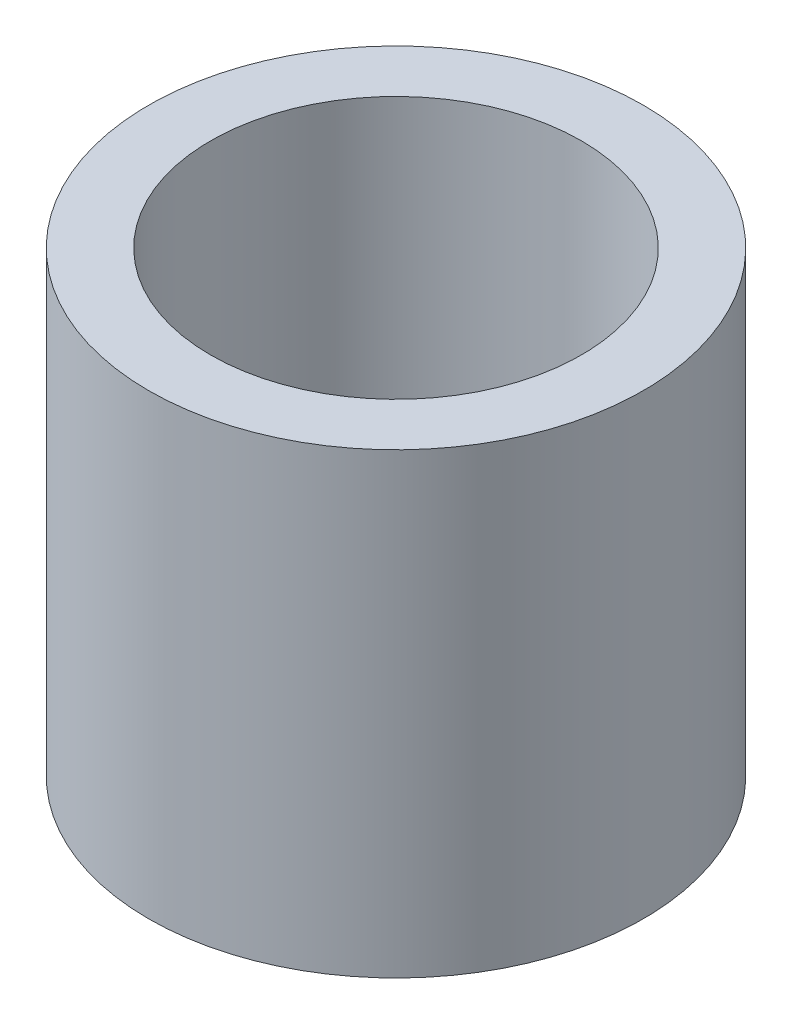
ISO-10303-21;
HEADER;
FILE_DESCRIPTION(('STEP AP214'),'2;1');
FILE_NAME('part.step','',(''),(''),'','','');
FILE_SCHEMA(('AUTOMOTIVE_DESIGN { 1 0 10303 214 1 1 1 1 }'));
ENDSEC;
DATA;
#1=APPLICATION_CONTEXT('core data for automotive mechanical design processes');
#2=APPLICATION_PROTOCOL_DEFINITION('international standard','automotive_design',2000,#1);
#3=PRODUCT_CONTEXT('',#1,'mechanical');
#4=PRODUCT('Part','Part','',(#3));
#5=PRODUCT_RELATED_PRODUCT_CATEGORY('part','',(#4));
#6=PRODUCT_DEFINITION_FORMATION('','',#4);
#7=PRODUCT_DEFINITION_CONTEXT('part definition',#1,'design');
#8=PRODUCT_DEFINITION('design','',#6,#7);
#9=PRODUCT_DEFINITION_SHAPE('','',#8);
#10=(LENGTH_UNIT() NAMED_UNIT(*) SI_UNIT(.MILLI.,.METRE.));
#11=(NAMED_UNIT(*) PLANE_ANGLE_UNIT() SI_UNIT($,.RADIAN.));
#12=(NAMED_UNIT(*) SI_UNIT($,.STERADIAN.) SOLID_ANGLE_UNIT());
#13=UNCERTAINTY_MEASURE_WITH_UNIT(LENGTH_MEASURE(1.E-05),#10,'distance_accuracy_value','');
#14=(GEOMETRIC_REPRESENTATION_CONTEXT(3) GLOBAL_UNCERTAINTY_ASSIGNED_CONTEXT((#13)) GLOBAL_UNIT_ASSIGNED_CONTEXT((#10,
#11,#12)) REPRESENTATION_CONTEXT('',''));
#15=CARTESIAN_POINT('',(0.,0.,0.));
#16=DIRECTION('',(0.,0.,1.));
#17=DIRECTION('',(1.,0.,0.));
#18=AXIS2_PLACEMENT_3D('',#15,#16,#17);
#19=CARTESIAN_POINT('',(0.,7.399,0.));
#20=DIRECTION('',(0.,-1.,0.));
#21=DIRECTION('',(0.,0.,-1.));
#22=AXIS2_PLACEMENT_3D('',#19,#20,#21);
#23=CYLINDRICAL_SURFACE('',#22,3.);
#24=CARTESIAN_POINT('',(0.,7.399,0.));
#25=DIRECTION('',(0.,1.,0.));
#26=DIRECTION('',(0.,0.,1.));
#27=AXIS2_PLACEMENT_3D('',#24,#25,#26);
#28=CIRCLE('',#27,3.);
#29=CARTESIAN_POINT('',(0.,7.399,-3.));
#30=VERTEX_POINT('',#29);
#31=EDGE_CURVE('E40',#30,#30,#28,.T.);
#32=CARTESIAN_POINT('',(0.,0.,0.));
#33=DIRECTION('',(0.,1.,0.));
#34=DIRECTION('',(0.,0.,1.));
#35=AXIS2_PLACEMENT_3D('',#32,#33,#34);
#36=CIRCLE('',#35,3.);
#37=CARTESIAN_POINT('',(0.,0.,-3.));
#38=VERTEX_POINT('',#37);
#39=EDGE_CURVE('E46',#38,#38,#36,.T.);
#40=CARTESIAN_POINT('',(0.,7.399,-3.));
#41=CARTESIAN_POINT('',(0.,7.32192708333333,-3.));
#42=CARTESIAN_POINT('',(0.,7.24485416666667,-3.));
#43=CARTESIAN_POINT('',(0.,7.09070833333333,-3.));
#44=CARTESIAN_POINT('',(0.,7.01363541666667,-3.));
#45=CARTESIAN_POINT('',(0.,6.85948958333333,-3.));
#46=CARTESIAN_POINT('',(0.,6.78241666666667,-3.));
#47=CARTESIAN_POINT('',(0.,6.62827083333333,-3.));
#48=CARTESIAN_POINT('',(0.,6.55119791666667,-3.));
#49=CARTESIAN_POINT('',(0.,6.39705208333333,-3.));
#50=CARTESIAN_POINT('',(0.,6.31997916666667,-3.));
#51=CARTESIAN_POINT('',(0.,6.16583333333333,-3.));
#52=CARTESIAN_POINT('',(0.,6.08876041666667,-3.));
#53=CARTESIAN_POINT('',(0.,5.93461458333333,-3.));
#54=CARTESIAN_POINT('',(0.,5.85754166666667,-3.));
#55=CARTESIAN_POINT('',(0.,5.70339583333333,-3.));
#56=CARTESIAN_POINT('',(0.,5.62632291666667,-3.));
#57=CARTESIAN_POINT('',(0.,5.47217708333333,-3.));
#58=CARTESIAN_POINT('',(0.,5.39510416666667,-3.));
#59=CARTESIAN_POINT('',(0.,5.24095833333333,-3.));
#60=CARTESIAN_POINT('',(0.,5.16388541666667,-3.));
#61=CARTESIAN_POINT('',(0.,5.00973958333333,-3.));
#62=CARTESIAN_POINT('',(0.,4.93266666666667,-3.));
#63=CARTESIAN_POINT('',(0.,4.77852083333333,-3.));
#64=CARTESIAN_POINT('',(0.,4.70144791666667,-3.));
#65=CARTESIAN_POINT('',(0.,4.54730208333333,-3.));
#66=CARTESIAN_POINT('',(0.,4.47022916666667,-3.));
#67=CARTESIAN_POINT('',(0.,4.31608333333333,-3.));
#68=CARTESIAN_POINT('',(0.,4.23901041666667,-3.));
#69=CARTESIAN_POINT('',(0.,4.08486458333333,-3.));
#70=CARTESIAN_POINT('',(0.,4.00779166666667,-3.));
#71=CARTESIAN_POINT('',(0.,3.85364583333333,-3.));
#72=CARTESIAN_POINT('',(0.,3.77657291666667,-3.));
#73=CARTESIAN_POINT('',(0.,3.62242708333333,-3.));
#74=CARTESIAN_POINT('',(0.,3.54535416666667,-3.));
#75=CARTESIAN_POINT('',(0.,3.39120833333333,-3.));
#76=CARTESIAN_POINT('',(0.,3.31413541666667,-3.));
#77=CARTESIAN_POINT('',(0.,3.15998958333333,-3.));
#78=CARTESIAN_POINT('',(0.,3.08291666666667,-3.));
#79=CARTESIAN_POINT('',(0.,2.92877083333333,-3.));
#80=CARTESIAN_POINT('',(0.,2.85169791666667,-3.));
#81=CARTESIAN_POINT('',(0.,2.69755208333333,-3.));
#82=CARTESIAN_POINT('',(0.,2.62047916666667,-3.));
#83=CARTESIAN_POINT('',(0.,2.46633333333333,-3.));
#84=CARTESIAN_POINT('',(0.,2.38926041666667,-3.));
#85=CARTESIAN_POINT('',(0.,2.23511458333333,-3.));
#86=CARTESIAN_POINT('',(0.,2.15804166666667,-3.));
#87=CARTESIAN_POINT('',(0.,2.00389583333333,-3.));
#88=CARTESIAN_POINT('',(0.,1.92682291666667,-3.));
#89=CARTESIAN_POINT('',(0.,1.77267708333333,-3.));
#90=CARTESIAN_POINT('',(0.,1.69560416666667,-3.));
#91=CARTESIAN_POINT('',(0.,1.54145833333333,-3.));
#92=CARTESIAN_POINT('',(0.,1.46438541666667,-3.));
#93=CARTESIAN_POINT('',(0.,1.31023958333333,-3.));
#94=CARTESIAN_POINT('',(0.,1.23316666666667,-3.));
#95=CARTESIAN_POINT('',(0.,1.07902083333333,-3.));
#96=CARTESIAN_POINT('',(0.,1.00194791666667,-3.));
#97=CARTESIAN_POINT('',(0.,0.847802083333334,-3.));
#98=CARTESIAN_POINT('',(0.,0.770729166666667,-3.));
#99=CARTESIAN_POINT('',(0.,0.616583333333333,-3.));
#100=CARTESIAN_POINT('',(0.,0.539510416666667,-3.));
#101=CARTESIAN_POINT('',(0.,0.385364583333333,-3.));
#102=CARTESIAN_POINT('',(0.,0.308291666666666,-3.));
#103=CARTESIAN_POINT('',(0.,0.154145833333333,-3.));
#104=CARTESIAN_POINT('',(0.,0.0770729166666666,-3.));
#105=CARTESIAN_POINT('',(0.,0.,-3.));
#106=B_SPLINE_CURVE_WITH_KNOTS('',3,(#40,#41,#42,#43,#44,#45,#46,#47,#48,#49,#50,#51,#52,#53,
#54,#55,#56,#57,#58,#59,#60,#61,#62,#63,#64,#65,#66,#67,#68,#69,#70,#71,#72,#73,#74,#75,#76,#77,
#78,#79,#80,#81,#82,#83,#84,#85,#86,#87,#88,#89,#90,#91,#92,#93,#94,#95,#96,#97,#98,#99,#100,
#101,#102,#103,#104,#105),.UNSPECIFIED.,.F.,.F.,(4,2,2,2,2,2,2,2,2,2,2,2,2,2,2,2,2,2,2,2,2,2,2,
2,2,2,2,2,2,2,2,2,4),(0.,0.231218750000001,0.4624375,0.693656250000001,0.924875,1.15609375,
1.3873125,1.61853125,1.84975,2.08096875,2.3121875,2.54340625,2.774625,3.00584375,3.2370625,
3.46828125,3.6995,3.93071875,4.1619375,4.39315625,4.624375,4.85559375,5.0868125,5.31803125,
5.54925,5.78046875,6.0116875,6.24290625,6.474125,6.70534375,6.9365625,7.16778125,7.399),.UNSPECIFIED.);
#107=EDGE_CURVE('BSEAM33',#30,#38,#106,.T.);
#108=ORIENTED_EDGE('',*,*,#31,.T.);
#109=ORIENTED_EDGE('',*,*,#39,.F.);
#110=ORIENTED_EDGE('',*,*,#107,.T.);
#111=ORIENTED_EDGE('',*,*,#107,.F.);
#112=EDGE_LOOP('',(#108,#110,#109,#111));
#113=FACE_BOUND('',#112,.T.);
#114=ADVANCED_FACE('F33',(#113),#23,.F.);
#115=CARTESIAN_POINT('',(0.,7.399,0.));
#116=DIRECTION('',(0.,-1.,0.));
#117=DIRECTION('',(0.,0.,-1.));
#118=AXIS2_PLACEMENT_3D('',#115,#116,#117);
#119=CYLINDRICAL_SURFACE('',#118,4.);
#120=CARTESIAN_POINT('',(0.,7.399,0.));
#121=DIRECTION('',(0.,1.,0.));
#122=DIRECTION('',(0.,0.,1.));
#123=AXIS2_PLACEMENT_3D('',#120,#121,#122);
#124=CIRCLE('',#123,4.);
#125=CARTESIAN_POINT('',(0.,7.399,-4.));
#126=VERTEX_POINT('',#125);
#127=EDGE_CURVE('E10',#126,#126,#124,.T.);
#128=CARTESIAN_POINT('',(0.,0.,0.));
#129=DIRECTION('',(0.,1.,0.));
#130=DIRECTION('',(0.,0.,1.));
#131=AXIS2_PLACEMENT_3D('',#128,#129,#130);
#132=CIRCLE('',#131,4.);
#133=CARTESIAN_POINT('',(0.,0.,-4.));
#134=VERTEX_POINT('',#133);
#135=EDGE_CURVE('E36',#134,#134,#132,.T.);
#136=CARTESIAN_POINT('',(0.,7.399,-4.));
#137=CARTESIAN_POINT('',(0.,7.32192708333333,-4.));
#138=CARTESIAN_POINT('',(0.,7.24485416666667,-4.));
#139=CARTESIAN_POINT('',(0.,7.09070833333333,-4.));
#140=CARTESIAN_POINT('',(0.,7.01363541666667,-4.));
#141=CARTESIAN_POINT('',(0.,6.85948958333333,-4.));
#142=CARTESIAN_POINT('',(0.,6.78241666666667,-4.));
#143=CARTESIAN_POINT('',(0.,6.62827083333333,-4.));
#144=CARTESIAN_POINT('',(0.,6.55119791666667,-4.));
#145=CARTESIAN_POINT('',(0.,6.39705208333333,-4.));
#146=CARTESIAN_POINT('',(0.,6.31997916666667,-4.));
#147=CARTESIAN_POINT('',(0.,6.16583333333333,-4.));
#148=CARTESIAN_POINT('',(0.,6.08876041666667,-4.));
#149=CARTESIAN_POINT('',(0.,5.93461458333333,-4.));
#150=CARTESIAN_POINT('',(0.,5.85754166666667,-4.));
#151=CARTESIAN_POINT('',(0.,5.70339583333333,-4.));
#152=CARTESIAN_POINT('',(0.,5.62632291666667,-4.));
#153=CARTESIAN_POINT('',(0.,5.47217708333333,-4.));
#154=CARTESIAN_POINT('',(0.,5.39510416666667,-4.));
#155=CARTESIAN_POINT('',(0.,5.24095833333333,-4.));
#156=CARTESIAN_POINT('',(0.,5.16388541666667,-4.));
#157=CARTESIAN_POINT('',(0.,5.00973958333333,-4.));
#158=CARTESIAN_POINT('',(0.,4.93266666666667,-4.));
#159=CARTESIAN_POINT('',(0.,4.77852083333333,-4.));
#160=CARTESIAN_POINT('',(0.,4.70144791666667,-4.));
#161=CARTESIAN_POINT('',(0.,4.54730208333333,-4.));
#162=CARTESIAN_POINT('',(0.,4.47022916666667,-4.));
#163=CARTESIAN_POINT('',(0.,4.31608333333333,-4.));
#164=CARTESIAN_POINT('',(0.,4.23901041666667,-4.));
#165=CARTESIAN_POINT('',(0.,4.08486458333333,-4.));
#166=CARTESIAN_POINT('',(0.,4.00779166666667,-4.));
#167=CARTESIAN_POINT('',(0.,3.85364583333333,-4.));
#168=CARTESIAN_POINT('',(0.,3.77657291666667,-4.));
#169=CARTESIAN_POINT('',(0.,3.62242708333333,-4.));
#170=CARTESIAN_POINT('',(0.,3.54535416666667,-4.));
#171=CARTESIAN_POINT('',(0.,3.39120833333333,-4.));
#172=CARTESIAN_POINT('',(0.,3.31413541666667,-4.));
#173=CARTESIAN_POINT('',(0.,3.15998958333333,-4.));
#174=CARTESIAN_POINT('',(0.,3.08291666666667,-4.));
#175=CARTESIAN_POINT('',(0.,2.92877083333333,-4.));
#176=CARTESIAN_POINT('',(0.,2.85169791666667,-4.));
#177=CARTESIAN_POINT('',(0.,2.69755208333333,-4.));
#178=CARTESIAN_POINT('',(0.,2.62047916666667,-4.));
#179=CARTESIAN_POINT('',(0.,2.46633333333333,-4.));
#180=CARTESIAN_POINT('',(0.,2.38926041666667,-4.));
#181=CARTESIAN_POINT('',(0.,2.23511458333333,-4.));
#182=CARTESIAN_POINT('',(0.,2.15804166666667,-4.));
#183=CARTESIAN_POINT('',(0.,2.00389583333333,-4.));
#184=CARTESIAN_POINT('',(0.,1.92682291666667,-4.));
#185=CARTESIAN_POINT('',(0.,1.77267708333333,-4.));
#186=CARTESIAN_POINT('',(0.,1.69560416666667,-4.));
#187=CARTESIAN_POINT('',(0.,1.54145833333333,-4.));
#188=CARTESIAN_POINT('',(0.,1.46438541666667,-4.));
#189=CARTESIAN_POINT('',(0.,1.31023958333333,-4.));
#190=CARTESIAN_POINT('',(0.,1.23316666666667,-4.));
#191=CARTESIAN_POINT('',(0.,1.07902083333333,-4.));
#192=CARTESIAN_POINT('',(0.,1.00194791666667,-4.));
#193=CARTESIAN_POINT('',(0.,0.847802083333333,-4.));
#194=CARTESIAN_POINT('',(0.,0.770729166666667,-4.));
#195=CARTESIAN_POINT('',(0.,0.616583333333333,-4.));
#196=CARTESIAN_POINT('',(0.,0.539510416666667,-4.));
#197=CARTESIAN_POINT('',(0.,0.385364583333333,-4.));
#198=CARTESIAN_POINT('',(0.,0.308291666666666,-4.));
#199=CARTESIAN_POINT('',(0.,0.154145833333333,-4.));
#200=CARTESIAN_POINT('',(0.,0.0770729166666666,-4.));
#201=CARTESIAN_POINT('',(0.,0.,-4.));
#202=B_SPLINE_CURVE_WITH_KNOTS('',3,(#136,#137,#138,#139,#140,#141,#142,#143,#144,#145,#146,
#147,#148,#149,#150,#151,#152,#153,#154,#155,#156,#157,#158,#159,#160,#161,#162,#163,#164,#165,
#166,#167,#168,#169,#170,#171,#172,#173,#174,#175,#176,#177,#178,#179,#180,#181,#182,#183,#184,
#185,#186,#187,#188,#189,#190,#191,#192,#193,#194,#195,#196,#197,#198,#199,#200,#201),
.UNSPECIFIED.,.F.,.F.,(4,2,2,2,2,2,2,2,2,2,2,2,2,2,2,2,2,2,2,2,2,2,2,2,2,2,2,2,2,2,2,2,4),(0.,
0.23121875,0.462437499999999,0.69365625,0.924874999999999,1.15609375,1.3873125,1.61853125,
1.84975,2.08096875,2.3121875,2.54340625,2.774625,3.00584375,3.2370625,3.46828125,3.6995,
3.93071875,4.1619375,4.39315625,4.624375,4.85559375,5.0868125,5.31803125,5.54925,5.78046875,
6.0116875,6.24290625,6.474125,6.70534375,6.9365625,7.16778125,7.399),.UNSPECIFIED.);
#203=EDGE_CURVE('BSEAM53',#126,#134,#202,.T.);
#204=ORIENTED_EDGE('',*,*,#127,.F.);
#205=ORIENTED_EDGE('',*,*,#135,.T.);
#206=ORIENTED_EDGE('',*,*,#203,.T.);
#207=ORIENTED_EDGE('',*,*,#203,.F.);
#208=EDGE_LOOP('',(#204,#206,#205,#207));
#209=FACE_BOUND('',#208,.T.);
#210=ADVANCED_FACE('F53',(#209),#119,.T.);
#211=CARTESIAN_POINT('',(0.,7.399,0.));
#212=DIRECTION('',(0.,1.,0.));
#213=DIRECTION('',(0.,0.,1.));
#214=AXIS2_PLACEMENT_3D('',#211,#212,#213);
#215=PLANE('',#214);
#216=ORIENTED_EDGE('',*,*,#31,.F.);
#217=EDGE_LOOP('',(#216));
#218=FACE_BOUND('',#217,.T.);
#219=ORIENTED_EDGE('',*,*,#127,.T.);
#220=EDGE_LOOP('',(#219));
#221=FACE_BOUND('',#220,.T.);
#222=ADVANCED_FACE('F57',(#218,#221),#215,.T.);
#223=CARTESIAN_POINT('',(0.,0.,0.));
#224=DIRECTION('',(0.,1.,0.));
#225=DIRECTION('',(0.,0.,1.));
#226=AXIS2_PLACEMENT_3D('',#223,#224,#225);
#227=PLANE('',#226);
#228=ORIENTED_EDGE('',*,*,#39,.T.);
#229=EDGE_LOOP('',(#228));
#230=FACE_BOUND('',#229,.T.);
#231=ORIENTED_EDGE('',*,*,#135,.F.);
#232=EDGE_LOOP('',(#231));
#233=FACE_BOUND('',#232,.T.);
#234=ADVANCED_FACE('F55',(#230,#233),#227,.F.);
#235=CLOSED_SHELL('',(#114,#210,#222,#234));
#236=MANIFOLD_SOLID_BREP('B2',#235);
#237=ADVANCED_BREP_SHAPE_REPRESENTATION('',(#18,#236),#14);
#238=SHAPE_DEFINITION_REPRESENTATION(#9,#237);
ENDSEC;
END-ISO-10303-21;
